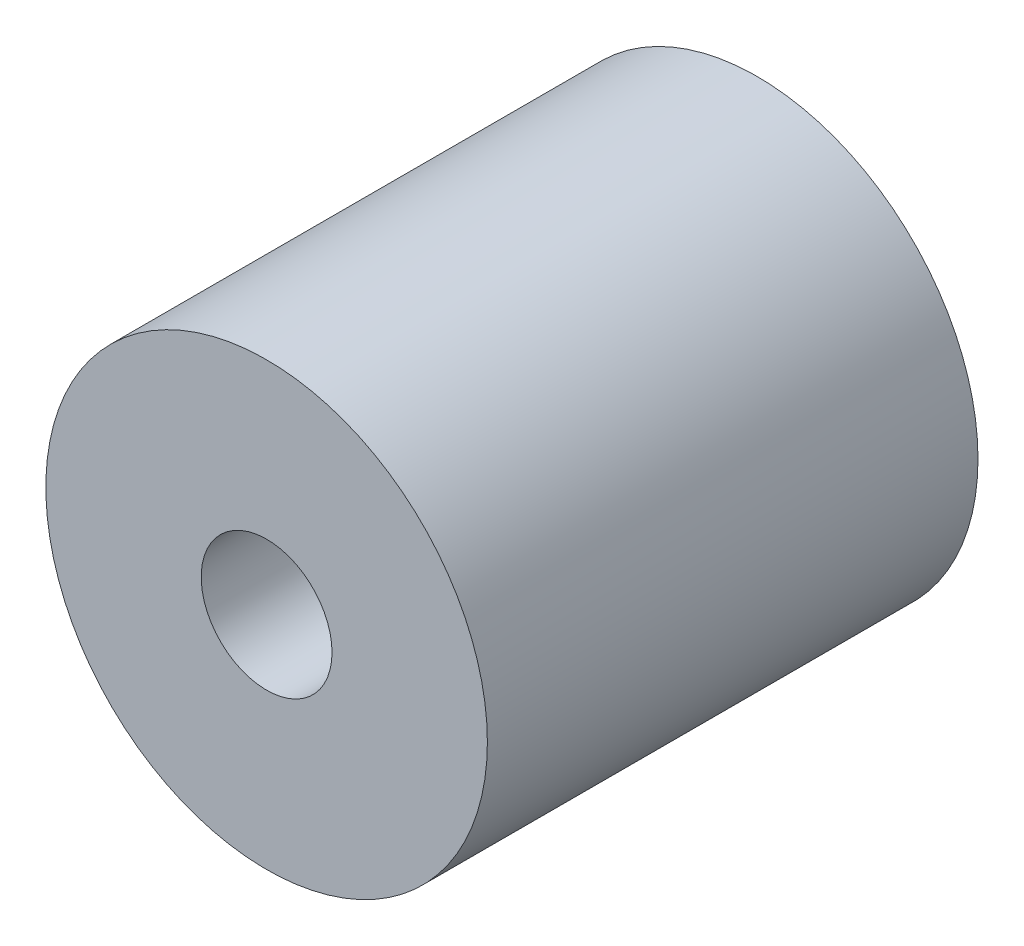
ISO-10303-21;
HEADER;
FILE_DESCRIPTION(('STEP AP214'),'2;1');
FILE_NAME('part.step','',(''),(''),'','','');
FILE_SCHEMA(('AUTOMOTIVE_DESIGN { 1 0 10303 214 1 1 1 1 }'));
ENDSEC;
DATA;
#1=APPLICATION_CONTEXT('core data for automotive mechanical design processes');
#2=APPLICATION_PROTOCOL_DEFINITION('international standard','automotive_design',2000,#1);
#3=PRODUCT_CONTEXT('',#1,'mechanical');
#4=PRODUCT('Part','Part','',(#3));
#5=PRODUCT_RELATED_PRODUCT_CATEGORY('part','',(#4));
#6=PRODUCT_DEFINITION_FORMATION('','',#4);
#7=PRODUCT_DEFINITION_CONTEXT('part definition',#1,'design');
#8=PRODUCT_DEFINITION('design','',#6,#7);
#9=PRODUCT_DEFINITION_SHAPE('','',#8);
#10=(LENGTH_UNIT() NAMED_UNIT(*) SI_UNIT(.MILLI.,.METRE.));
#11=(NAMED_UNIT(*) PLANE_ANGLE_UNIT() SI_UNIT($,.RADIAN.));
#12=(NAMED_UNIT(*) SI_UNIT($,.STERADIAN.) SOLID_ANGLE_UNIT());
#13=UNCERTAINTY_MEASURE_WITH_UNIT(LENGTH_MEASURE(1.E-05),#10,'distance_accuracy_value','');
#14=(GEOMETRIC_REPRESENTATION_CONTEXT(3) GLOBAL_UNCERTAINTY_ASSIGNED_CONTEXT((#13)) GLOBAL_UNIT_ASSIGNED_CONTEXT((#10,
#11,#12)) REPRESENTATION_CONTEXT('',''));
#15=CARTESIAN_POINT('',(0.,0.,0.));
#16=DIRECTION('',(0.,0.,1.));
#17=DIRECTION('',(1.,0.,0.));
#18=AXIS2_PLACEMENT_3D('',#15,#16,#17);
#19=CARTESIAN_POINT('',(0.,0.,15.));
#20=DIRECTION('',(0.,0.,1.));
#21=DIRECTION('',(1.,0.,0.));
#22=AXIS2_PLACEMENT_3D('',#19,#20,#21);
#23=PLANE('',#22);
#24=CARTESIAN_POINT('',(0.,0.,15.));
#25=DIRECTION('',(0.,0.,1.));
#26=DIRECTION('',(1.,0.,0.));
#27=AXIS2_PLACEMENT_3D('',#24,#25,#26);
#28=CIRCLE('',#27,6.75);
#29=CARTESIAN_POINT('',(6.75,0.,15.));
#30=VERTEX_POINT('',#29);
#31=EDGE_CURVE('E10',#30,#30,#28,.T.);
#32=ORIENTED_EDGE('',*,*,#31,.T.);
#33=EDGE_LOOP('',(#32));
#34=FACE_BOUND('',#33,.T.);
#35=CARTESIAN_POINT('',(0.,0.,15.));
#36=DIRECTION('',(0.,0.,1.));
#37=DIRECTION('',(1.,0.,0.));
#38=AXIS2_PLACEMENT_3D('',#35,#36,#37);
#39=CIRCLE('',#38,2.);
#40=CARTESIAN_POINT('',(2.,0.,15.));
#41=VERTEX_POINT('',#40);
#42=EDGE_CURVE('E42',#41,#41,#39,.T.);
#43=ORIENTED_EDGE('',*,*,#42,.F.);
#44=EDGE_LOOP('',(#43));
#45=FACE_BOUND('',#44,.T.);
#46=ADVANCED_FACE('F31',(#34,#45),#23,.T.);
#47=CARTESIAN_POINT('',(0.,0.,0.));
#48=DIRECTION('',(0.,0.,1.));
#49=DIRECTION('',(1.,0.,0.));
#50=AXIS2_PLACEMENT_3D('',#47,#48,#49);
#51=PLANE('',#50);
#52=CARTESIAN_POINT('',(0.,0.,0.));
#53=DIRECTION('',(0.,0.,1.));
#54=DIRECTION('',(1.,0.,0.));
#55=AXIS2_PLACEMENT_3D('',#52,#53,#54);
#56=CIRCLE('',#55,6.75);
#57=CARTESIAN_POINT('',(6.75,0.,0.));
#58=VERTEX_POINT('',#57);
#59=EDGE_CURVE('E35',#58,#58,#56,.T.);
#60=ORIENTED_EDGE('',*,*,#59,.F.);
#61=EDGE_LOOP('',(#60));
#62=FACE_BOUND('',#61,.T.);
#63=CARTESIAN_POINT('',(0.,0.,0.));
#64=DIRECTION('',(0.,0.,1.));
#65=DIRECTION('',(1.,0.,0.));
#66=AXIS2_PLACEMENT_3D('',#63,#64,#65);
#67=CIRCLE('',#66,2.);
#68=CARTESIAN_POINT('',(2.,0.,0.));
#69=VERTEX_POINT('',#68);
#70=EDGE_CURVE('E44',#69,#69,#67,.T.);
#71=ORIENTED_EDGE('',*,*,#70,.T.);
#72=EDGE_LOOP('',(#71));
#73=FACE_BOUND('',#72,.T.);
#74=ADVANCED_FACE('F54',(#62,#73),#51,.F.);
#75=CARTESIAN_POINT('',(0.,0.,15.));
#76=DIRECTION('',(0.,0.,-1.));
#77=DIRECTION('',(-1.,0.,0.));
#78=AXIS2_PLACEMENT_3D('',#75,#76,#77);
#79=CYLINDRICAL_SURFACE('',#78,6.75);
#80=ORIENTED_EDGE('',*,*,#31,.F.);
#81=EDGE_LOOP('',(#80));
#82=FACE_BOUND('',#81,.T.);
#83=ORIENTED_EDGE('',*,*,#59,.T.);
#84=EDGE_LOOP('',(#83));
#85=FACE_BOUND('',#84,.T.);
#86=ADVANCED_FACE('F33',(#82,#85),#79,.T.);
#87=CARTESIAN_POINT('',(0.,0.,15.));
#88=DIRECTION('',(0.,0.,-1.));
#89=DIRECTION('',(-1.,0.,0.));
#90=AXIS2_PLACEMENT_3D('',#87,#88,#89);
#91=CYLINDRICAL_SURFACE('',#90,2.);
#92=ORIENTED_EDGE('',*,*,#42,.T.);
#93=EDGE_LOOP('',(#92));
#94=FACE_BOUND('',#93,.T.);
#95=ORIENTED_EDGE('',*,*,#70,.F.);
#96=EDGE_LOOP('',(#95));
#97=FACE_BOUND('',#96,.T.);
#98=ADVANCED_FACE('F50',(#94,#97),#91,.F.);
#99=CLOSED_SHELL('',(#46,#74,#86,#98));
#100=MANIFOLD_SOLID_BREP('B2',#99);
#101=ADVANCED_BREP_SHAPE_REPRESENTATION('',(#18,#100),#14);
#102=SHAPE_DEFINITION_REPRESENTATION(#9,#101);
ENDSEC;
END-ISO-10303-21;
